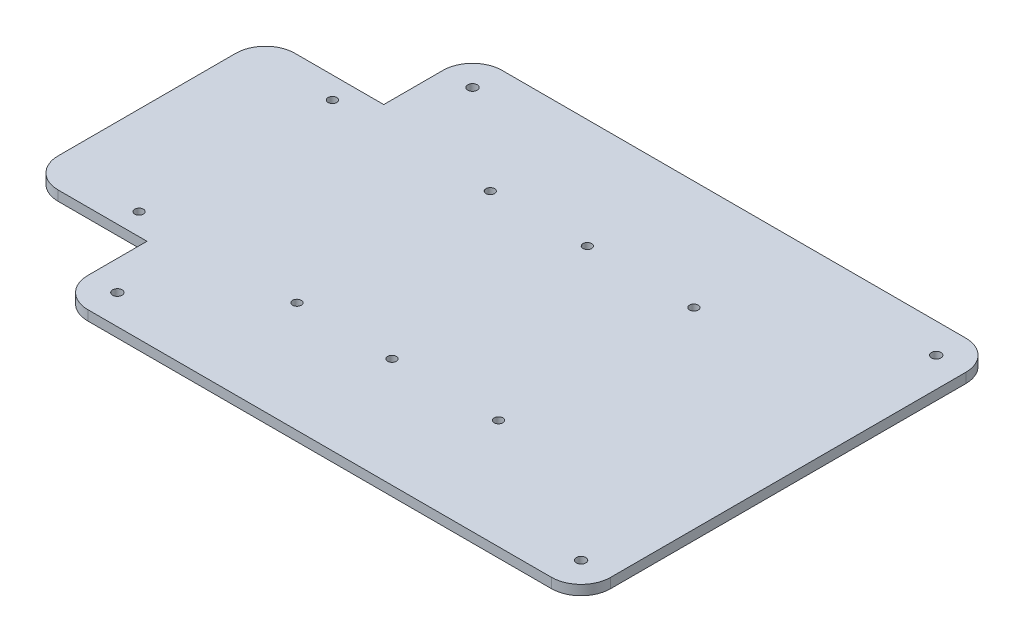
ISO-10303-21;
HEADER;
FILE_DESCRIPTION(('STEP AP214'),'2;1');
FILE_NAME('part.step','',(''),(''),'','','');
FILE_SCHEMA(('AUTOMOTIVE_DESIGN { 1 0 10303 214 1 1 1 1 }'));
ENDSEC;
DATA;
#1=APPLICATION_CONTEXT('core data for automotive mechanical design processes');
#2=APPLICATION_PROTOCOL_DEFINITION('international standard','automotive_design',2000,#1);
#3=PRODUCT_CONTEXT('',#1,'mechanical');
#4=PRODUCT('Part','Part','',(#3));
#5=PRODUCT_RELATED_PRODUCT_CATEGORY('part','',(#4));
#6=PRODUCT_DEFINITION_FORMATION('','',#4);
#7=PRODUCT_DEFINITION_CONTEXT('part definition',#1,'design');
#8=PRODUCT_DEFINITION('design','',#6,#7);
#9=PRODUCT_DEFINITION_SHAPE('','',#8);
#10=(LENGTH_UNIT() NAMED_UNIT(*) SI_UNIT(.MILLI.,.METRE.));
#11=(NAMED_UNIT(*) PLANE_ANGLE_UNIT() SI_UNIT($,.RADIAN.));
#12=(NAMED_UNIT(*) SI_UNIT($,.STERADIAN.) SOLID_ANGLE_UNIT());
#13=UNCERTAINTY_MEASURE_WITH_UNIT(LENGTH_MEASURE(1.E-05),#10,'distance_accuracy_value','');
#14=(GEOMETRIC_REPRESENTATION_CONTEXT(3) GLOBAL_UNCERTAINTY_ASSIGNED_CONTEXT((#13)) GLOBAL_UNIT_ASSIGNED_CONTEXT((#10,
#11,#12)) REPRESENTATION_CONTEXT('',''));
#15=CARTESIAN_POINT('',(0.,0.,0.));
#16=DIRECTION('',(0.,0.,1.));
#17=DIRECTION('',(1.,0.,0.));
#18=AXIS2_PLACEMENT_3D('',#15,#16,#17);
#19=CARTESIAN_POINT('',(-132.5,5.,-105.));
#20=DIRECTION('',(1.,0.,0.));
#21=DIRECTION('',(0.,0.,-1.));
#22=AXIS2_PLACEMENT_3D('',#19,#20,#21);
#23=PLANE('',#22);
#24=DIRECTION('',(0.,-1.,0.));
#25=VECTOR('',#24,1.);
#26=CARTESIAN_POINT('',(-132.5,5.,-60.));
#27=LINE('',#26,#25);
#28=CARTESIAN_POINT('',(-132.5,5.,-60.));
#29=VERTEX_POINT('',#28);
#30=CARTESIAN_POINT('',(-132.5,0.,-60.));
#31=VERTEX_POINT('',#30);
#32=EDGE_CURVE('E169',#29,#31,#27,.T.);
#33=ORIENTED_EDGE('',*,*,#32,.F.);
#34=DIRECTION('',(0.,0.,1.));
#35=VECTOR('',#34,1.);
#36=CARTESIAN_POINT('',(-132.5,5.,-105.));
#37=LINE('',#36,#35);
#38=CARTESIAN_POINT('',(-132.5,5.,-90.));
#39=VERTEX_POINT('',#38);
#40=EDGE_CURVE('E201',#39,#29,#37,.T.);
#41=ORIENTED_EDGE('',*,*,#40,.F.);
#42=DIRECTION('',(0.,-1.,0.));
#43=VECTOR('',#42,1.);
#44=CARTESIAN_POINT('',(-132.5,5.,-90.));
#45=LINE('',#44,#43);
#46=CARTESIAN_POINT('',(-132.5,0.,-90.));
#47=VERTEX_POINT('',#46);
#48=EDGE_CURVE('E234',#39,#47,#45,.T.);
#49=ORIENTED_EDGE('',*,*,#48,.T.);
#50=DIRECTION('',(0.,0.,1.));
#51=VECTOR('',#50,1.);
#52=CARTESIAN_POINT('',(-132.5,0.,-105.));
#53=LINE('',#52,#51);
#54=EDGE_CURVE('E163',#47,#31,#53,.T.);
#55=ORIENTED_EDGE('',*,*,#54,.T.);
#56=EDGE_LOOP('',(#33,#41,#49,#55));
#57=FACE_BOUND('',#56,.T.);
#58=ADVANCED_FACE('F37',(#57),#23,.F.);
#59=DIRECTION('',(0.,-1.,0.));
#60=VECTOR('',#59,1.);
#61=CARTESIAN_POINT('',(-132.5,5.,60.));
#62=LINE('',#61,#60);
#63=CARTESIAN_POINT('',(-132.5,5.,60.));
#64=VERTEX_POINT('',#63);
#65=CARTESIAN_POINT('',(-132.5,0.,60.));
#66=VERTEX_POINT('',#65);
#67=EDGE_CURVE('E148',#64,#66,#62,.T.);
#68=ORIENTED_EDGE('',*,*,#67,.T.);
#69=CARTESIAN_POINT('',(-132.5,0.,90.));
#70=VERTEX_POINT('',#69);
#71=EDGE_CURVE('E156',#66,#70,#53,.T.);
#72=ORIENTED_EDGE('',*,*,#71,.T.);
#73=DIRECTION('',(0.,-1.,0.));
#74=VECTOR('',#73,1.);
#75=CARTESIAN_POINT('',(-132.5,5.,90.));
#76=LINE('',#75,#74);
#77=CARTESIAN_POINT('',(-132.5,5.,90.));
#78=VERTEX_POINT('',#77);
#79=EDGE_CURVE('E237',#70,#78,#76,.F.);
#80=ORIENTED_EDGE('',*,*,#79,.T.);
#81=EDGE_CURVE('E168',#64,#78,#37,.T.);
#82=ORIENTED_EDGE('',*,*,#81,.F.);
#83=EDGE_LOOP('',(#68,#72,#80,#82));
#84=FACE_BOUND('',#83,.T.);
#85=ADVANCED_FACE('F167',(#84),#23,.F.);
#86=CARTESIAN_POINT('',(-132.5,5.,105.));
#87=DIRECTION('',(0.,0.,-1.));
#88=DIRECTION('',(-1.,0.,0.));
#89=AXIS2_PLACEMENT_3D('',#86,#87,#88);
#90=PLANE('',#89);
#91=DIRECTION('',(1.,0.,0.));
#92=VECTOR('',#91,1.);
#93=CARTESIAN_POINT('',(-132.5,5.,105.));
#94=LINE('',#93,#92);
#95=CARTESIAN_POINT('',(-117.5,5.,105.));
#96=VERTEX_POINT('',#95);
#97=CARTESIAN_POINT('',(117.5,5.,105.));
#98=VERTEX_POINT('',#97);
#99=EDGE_CURVE('E204',#96,#98,#94,.T.);
#100=ORIENTED_EDGE('',*,*,#99,.F.);
#101=DIRECTION('',(0.,-1.,0.));
#102=VECTOR('',#101,1.);
#103=CARTESIAN_POINT('',(-117.5,5.,105.));
#104=LINE('',#103,#102);
#105=CARTESIAN_POINT('',(-117.5,0.,105.));
#106=VERTEX_POINT('',#105);
#107=EDGE_CURVE('E224',#96,#106,#104,.T.);
#108=ORIENTED_EDGE('',*,*,#107,.T.);
#109=DIRECTION('',(1.,0.,0.));
#110=VECTOR('',#109,1.);
#111=CARTESIAN_POINT('',(-132.5,0.,105.));
#112=LINE('',#111,#110);
#113=CARTESIAN_POINT('',(117.5,0.,105.));
#114=VERTEX_POINT('',#113);
#115=EDGE_CURVE('E214',#106,#114,#112,.T.);
#116=ORIENTED_EDGE('',*,*,#115,.T.);
#117=DIRECTION('',(0.,-1.,0.));
#118=VECTOR('',#117,1.);
#119=CARTESIAN_POINT('',(117.5,5.,105.));
#120=LINE('',#119,#118);
#121=EDGE_CURVE('E212',#114,#98,#120,.F.);
#122=ORIENTED_EDGE('',*,*,#121,.T.);
#123=EDGE_LOOP('',(#100,#108,#116,#122));
#124=FACE_BOUND('',#123,.T.);
#125=ADVANCED_FACE('F351',(#124),#90,.F.);
#126=CARTESIAN_POINT('',(132.5,5.,-105.));
#127=DIRECTION('',(-1.,0.,0.));
#128=DIRECTION('',(0.,0.,1.));
#129=AXIS2_PLACEMENT_3D('',#126,#127,#128);
#130=PLANE('',#129);
#131=DIRECTION('',(0.,0.,-1.));
#132=VECTOR('',#131,1.);
#133=CARTESIAN_POINT('',(132.5,5.,-105.));
#134=LINE('',#133,#132);
#135=CARTESIAN_POINT('',(132.5,5.,90.));
#136=VERTEX_POINT('',#135);
#137=CARTESIAN_POINT('',(132.5,5.,-90.));
#138=VERTEX_POINT('',#137);
#139=EDGE_CURVE('E207',#136,#138,#134,.T.);
#140=ORIENTED_EDGE('',*,*,#139,.F.);
#141=DIRECTION('',(0.,-1.,0.));
#142=VECTOR('',#141,1.);
#143=CARTESIAN_POINT('',(132.5,5.,90.));
#144=LINE('',#143,#142);
#145=CARTESIAN_POINT('',(132.5,0.,90.));
#146=VERTEX_POINT('',#145);
#147=EDGE_CURVE('E249',#136,#146,#144,.T.);
#148=ORIENTED_EDGE('',*,*,#147,.T.);
#149=DIRECTION('',(0.,0.,-1.));
#150=VECTOR('',#149,1.);
#151=CARTESIAN_POINT('',(132.5,0.,-105.));
#152=LINE('',#151,#150);
#153=CARTESIAN_POINT('',(132.5,0.,-90.));
#154=VERTEX_POINT('',#153);
#155=EDGE_CURVE('E217',#146,#154,#152,.T.);
#156=ORIENTED_EDGE('',*,*,#155,.T.);
#157=DIRECTION('',(0.,-1.,0.));
#158=VECTOR('',#157,1.);
#159=CARTESIAN_POINT('',(132.5,5.,-90.));
#160=LINE('',#159,#158);
#161=EDGE_CURVE('E247',#154,#138,#160,.F.);
#162=ORIENTED_EDGE('',*,*,#161,.T.);
#163=EDGE_LOOP('',(#140,#148,#156,#162));
#164=FACE_BOUND('',#163,.T.);
#165=ADVANCED_FACE('F343',(#164),#130,.F.);
#166=CARTESIAN_POINT('',(-132.5,5.,-105.));
#167=DIRECTION('',(0.,0.,1.));
#168=DIRECTION('',(1.,0.,0.));
#169=AXIS2_PLACEMENT_3D('',#166,#167,#168);
#170=PLANE('',#169);
#171=DIRECTION('',(-1.,0.,0.));
#172=VECTOR('',#171,1.);
#173=CARTESIAN_POINT('',(-132.5,5.,-105.));
#174=LINE('',#173,#172);
#175=CARTESIAN_POINT('',(117.5,5.,-105.));
#176=VERTEX_POINT('',#175);
#177=CARTESIAN_POINT('',(-117.5,5.,-105.));
#178=VERTEX_POINT('',#177);
#179=EDGE_CURVE('E210',#176,#178,#174,.T.);
#180=ORIENTED_EDGE('',*,*,#179,.F.);
#181=DIRECTION('',(0.,-1.,0.));
#182=VECTOR('',#181,1.);
#183=CARTESIAN_POINT('',(117.5,5.,-105.));
#184=LINE('',#183,#182);
#185=CARTESIAN_POINT('',(117.5,0.,-105.));
#186=VERTEX_POINT('',#185);
#187=EDGE_CURVE('E254',#176,#186,#184,.T.);
#188=ORIENTED_EDGE('',*,*,#187,.T.);
#189=DIRECTION('',(-1.,0.,0.));
#190=VECTOR('',#189,1.);
#191=CARTESIAN_POINT('',(-132.5,0.,-105.));
#192=LINE('',#191,#190);
#193=CARTESIAN_POINT('',(-117.5,0.,-105.));
#194=VERTEX_POINT('',#193);
#195=EDGE_CURVE('E220',#186,#194,#192,.T.);
#196=ORIENTED_EDGE('',*,*,#195,.T.);
#197=DIRECTION('',(0.,-1.,0.));
#198=VECTOR('',#197,1.);
#199=CARTESIAN_POINT('',(-117.5,5.,-105.));
#200=LINE('',#199,#198);
#201=EDGE_CURVE('E252',#194,#178,#200,.F.);
#202=ORIENTED_EDGE('',*,*,#201,.T.);
#203=EDGE_LOOP('',(#180,#188,#196,#202));
#204=FACE_BOUND('',#203,.T.);
#205=ADVANCED_FACE('F334',(#204),#170,.F.);
#206=CARTESIAN_POINT('',(0.,5.,0.));
#207=DIRECTION('',(0.,1.,0.));
#208=DIRECTION('',(0.,0.,1.));
#209=AXIS2_PLACEMENT_3D('',#206,#207,#208);
#210=PLANE('',#209);
#211=CARTESIAN_POINT('',(-18.8,5.,49.5));
#212=DIRECTION('',(0.,1.,0.));
#213=DIRECTION('',(0.,0.,-1.));
#214=AXIS2_PLACEMENT_3D('',#211,#212,#213);
#215=CIRCLE('',#214,2.2);
#216=CARTESIAN_POINT('',(-18.8,5.,47.3));
#217=VERTEX_POINT('',#216);
#218=EDGE_CURVE('E480',#217,#217,#215,.T.);
#219=ORIENTED_EDGE('',*,*,#218,.F.);
#220=EDGE_LOOP('',(#219));
#221=FACE_BOUND('',#220,.T.);
#222=CARTESIAN_POINT('',(35.2,5.,49.5));
#223=DIRECTION('',(0.,1.,0.));
#224=DIRECTION('',(0.,0.,-1.));
#225=AXIS2_PLACEMENT_3D('',#222,#223,#224);
#226=CIRCLE('',#225,2.19999999999998);
#227=CARTESIAN_POINT('',(35.2,5.,47.3));
#228=VERTEX_POINT('',#227);
#229=EDGE_CURVE('E475',#228,#228,#226,.T.);
#230=ORIENTED_EDGE('',*,*,#229,.F.);
#231=EDGE_LOOP('',(#230));
#232=FACE_BOUND('',#231,.T.);
#233=CARTESIAN_POINT('',(35.2,5.,-49.5));
#234=DIRECTION('',(0.,1.,0.));
#235=DIRECTION('',(0.,0.,1.));
#236=AXIS2_PLACEMENT_3D('',#233,#234,#235);
#237=CIRCLE('',#236,2.19999999999998);
#238=CARTESIAN_POINT('',(35.2,5.,-47.3));
#239=VERTEX_POINT('',#238);
#240=EDGE_CURVE('E436',#239,#239,#237,.T.);
#241=ORIENTED_EDGE('',*,*,#240,.F.);
#242=EDGE_LOOP('',(#241));
#243=FACE_BOUND('',#242,.T.);
#244=CARTESIAN_POINT('',(-18.8,5.,-49.5));
#245=DIRECTION('',(0.,1.,0.));
#246=DIRECTION('',(0.,0.,1.));
#247=AXIS2_PLACEMENT_3D('',#244,#245,#246);
#248=CIRCLE('',#247,2.2);
#249=CARTESIAN_POINT('',(-18.8,5.,-47.3));
#250=VERTEX_POINT('',#249);
#251=EDGE_CURVE('E287',#250,#250,#248,.T.);
#252=ORIENTED_EDGE('',*,*,#251,.F.);
#253=EDGE_LOOP('',(#252));
#254=FACE_BOUND('',#253,.T.);
#255=CARTESIAN_POINT('',(-147.5,5.,49.));
#256=DIRECTION('',(0.,1.,0.));
#257=DIRECTION('',(0.,0.,-1.));
#258=AXIS2_PLACEMENT_3D('',#255,#256,#257);
#259=CIRCLE('',#258,2.20000000000001);
#260=CARTESIAN_POINT('',(-147.5,5.,46.8));
#261=VERTEX_POINT('',#260);
#262=EDGE_CURVE('E294',#261,#261,#259,.T.);
#263=ORIENTED_EDGE('',*,*,#262,.F.);
#264=EDGE_LOOP('',(#263));
#265=FACE_BOUND('',#264,.T.);
#266=CARTESIAN_POINT('',(-67.5,5.,49.));
#267=DIRECTION('',(0.,1.,0.));
#268=DIRECTION('',(0.,0.,-1.));
#269=AXIS2_PLACEMENT_3D('',#266,#267,#268);
#270=CIRCLE('',#269,2.2);
#271=CARTESIAN_POINT('',(-67.5,5.,46.8));
#272=VERTEX_POINT('',#271);
#273=EDGE_CURVE('E298',#272,#272,#270,.T.);
#274=ORIENTED_EDGE('',*,*,#273,.F.);
#275=EDGE_LOOP('',(#274));
#276=FACE_BOUND('',#275,.T.);
#277=CARTESIAN_POINT('',(-67.5,5.,-49.));
#278=DIRECTION('',(0.,1.,0.));
#279=DIRECTION('',(0.,0.,1.));
#280=AXIS2_PLACEMENT_3D('',#277,#278,#279);
#281=CIRCLE('',#280,2.2);
#282=CARTESIAN_POINT('',(-67.5,5.,-46.8));
#283=VERTEX_POINT('',#282);
#284=EDGE_CURVE('E303',#283,#283,#281,.T.);
#285=ORIENTED_EDGE('',*,*,#284,.F.);
#286=EDGE_LOOP('',(#285));
#287=FACE_BOUND('',#286,.T.);
#288=CARTESIAN_POINT('',(-147.5,5.,-49.));
#289=DIRECTION('',(0.,1.,0.));
#290=DIRECTION('',(0.,0.,1.));
#291=AXIS2_PLACEMENT_3D('',#288,#289,#290);
#292=CIRCLE('',#291,2.20000000000001);
#293=CARTESIAN_POINT('',(-147.5,5.,-46.8));
#294=VERTEX_POINT('',#293);
#295=EDGE_CURVE('E273',#294,#294,#292,.T.);
#296=ORIENTED_EDGE('',*,*,#295,.F.);
#297=EDGE_LOOP('',(#296));
#298=FACE_BOUND('',#297,.T.);
#299=CARTESIAN_POINT('',(-117.5,5.,90.));
#300=DIRECTION('',(0.,1.,0.));
#301=DIRECTION('',(0.,0.,-1.));
#302=AXIS2_PLACEMENT_3D('',#299,#300,#301);
#303=CIRCLE('',#302,2.4);
#304=CARTESIAN_POINT('',(-117.5,5.,87.6));
#305=VERTEX_POINT('',#304);
#306=EDGE_CURVE('E192',#305,#305,#303,.T.);
#307=ORIENTED_EDGE('',*,*,#306,.F.);
#308=EDGE_LOOP('',(#307));
#309=FACE_BOUND('',#308,.T.);
#310=CARTESIAN_POINT('',(117.5,5.,90.));
#311=DIRECTION('',(0.,1.,0.));
#312=DIRECTION('',(0.,0.,1.));
#313=AXIS2_PLACEMENT_3D('',#310,#311,#312);
#314=CIRCLE('',#313,2.4);
#315=CARTESIAN_POINT('',(117.5,5.,92.4));
#316=VERTEX_POINT('',#315);
#317=EDGE_CURVE('E186',#316,#316,#314,.T.);
#318=ORIENTED_EDGE('',*,*,#317,.F.);
#319=EDGE_LOOP('',(#318));
#320=FACE_BOUND('',#319,.T.);
#321=CARTESIAN_POINT('',(117.5,5.,-90.));
#322=DIRECTION('',(0.,1.,0.));
#323=DIRECTION('',(0.,0.,-1.));
#324=AXIS2_PLACEMENT_3D('',#321,#322,#323);
#325=CIRCLE('',#324,2.4);
#326=CARTESIAN_POINT('',(117.5,5.,-92.4));
#327=VERTEX_POINT('',#326);
#328=EDGE_CURVE('E179',#327,#327,#325,.T.);
#329=ORIENTED_EDGE('',*,*,#328,.F.);
#330=EDGE_LOOP('',(#329));
#331=FACE_BOUND('',#330,.T.);
#332=CARTESIAN_POINT('',(-117.5,5.,-90.));
#333=DIRECTION('',(0.,1.,0.));
#334=DIRECTION('',(0.,0.,1.));
#335=AXIS2_PLACEMENT_3D('',#332,#333,#334);
#336=CIRCLE('',#335,2.4);
#337=CARTESIAN_POINT('',(-117.5,5.,-87.6));
#338=VERTEX_POINT('',#337);
#339=EDGE_CURVE('E182',#338,#338,#336,.T.);
#340=ORIENTED_EDGE('',*,*,#339,.F.);
#341=EDGE_LOOP('',(#340));
#342=FACE_BOUND('',#341,.T.);
#343=DIRECTION('',(0.,0.,1.));
#344=VECTOR('',#343,1.);
#345=CARTESIAN_POINT('',(-192.5,5.,-60.));
#346=LINE('',#345,#344);
#347=CARTESIAN_POINT('',(-192.5,5.,-45.));
#348=VERTEX_POINT('',#347);
#349=CARTESIAN_POINT('',(-192.5,5.,45.));
#350=VERTEX_POINT('',#349);
#351=EDGE_CURVE('E175',#348,#350,#346,.T.);
#352=ORIENTED_EDGE('',*,*,#351,.T.);
#353=CARTESIAN_POINT('',(-177.5,5.,45.));
#354=DIRECTION('',(0.,1.,0.));
#355=DIRECTION('',(0.,0.,1.));
#356=AXIS2_PLACEMENT_3D('',#353,#354,#355);
#357=CIRCLE('',#356,15.);
#358=CARTESIAN_POINT('',(-177.5,5.,60.));
#359=VERTEX_POINT('',#358);
#360=EDGE_CURVE('E46',#350,#359,#357,.T.);
#361=ORIENTED_EDGE('',*,*,#360,.T.);
#362=DIRECTION('',(1.,0.,0.));
#363=VECTOR('',#362,1.);
#364=CARTESIAN_POINT('',(-132.5,5.,60.));
#365=LINE('',#364,#363);
#366=EDGE_CURVE('E170',#359,#64,#365,.T.);
#367=ORIENTED_EDGE('',*,*,#366,.T.);
#368=ORIENTED_EDGE('',*,*,#81,.T.);
#369=CARTESIAN_POINT('',(-117.5,5.,90.));
#370=DIRECTION('',(0.,1.,0.));
#371=DIRECTION('',(0.,0.,1.));
#372=AXIS2_PLACEMENT_3D('',#369,#370,#371);
#373=CIRCLE('',#372,15.);
#374=EDGE_CURVE('E245',#78,#96,#373,.T.);
#375=ORIENTED_EDGE('',*,*,#374,.T.);
#376=ORIENTED_EDGE('',*,*,#99,.T.);
#377=CARTESIAN_POINT('',(117.5,5.,90.));
#378=DIRECTION('',(0.,1.,0.));
#379=DIRECTION('',(0.,0.,1.));
#380=AXIS2_PLACEMENT_3D('',#377,#378,#379);
#381=CIRCLE('',#380,15.);
#382=EDGE_CURVE('E243',#98,#136,#381,.T.);
#383=ORIENTED_EDGE('',*,*,#382,.T.);
#384=ORIENTED_EDGE('',*,*,#139,.T.);
#385=CARTESIAN_POINT('',(117.5,5.,-90.));
#386=DIRECTION('',(0.,1.,0.));
#387=DIRECTION('',(0.,0.,1.));
#388=AXIS2_PLACEMENT_3D('',#385,#386,#387);
#389=CIRCLE('',#388,15.);
#390=EDGE_CURVE('E241',#138,#176,#389,.T.);
#391=ORIENTED_EDGE('',*,*,#390,.T.);
#392=ORIENTED_EDGE('',*,*,#179,.T.);
#393=CARTESIAN_POINT('',(-117.5,5.,-90.));
#394=DIRECTION('',(0.,1.,0.));
#395=DIRECTION('',(0.,0.,1.));
#396=AXIS2_PLACEMENT_3D('',#393,#394,#395);
#397=CIRCLE('',#396,15.);
#398=EDGE_CURVE('E239',#178,#39,#397,.T.);
#399=ORIENTED_EDGE('',*,*,#398,.T.);
#400=ORIENTED_EDGE('',*,*,#40,.T.);
#401=DIRECTION('',(-1.,0.,0.));
#402=VECTOR('',#401,1.);
#403=CARTESIAN_POINT('',(-132.5,5.,-60.));
#404=LINE('',#403,#402);
#405=CARTESIAN_POINT('',(-177.5,5.,-60.));
#406=VERTEX_POINT('',#405);
#407=EDGE_CURVE('E152',#29,#406,#404,.T.);
#408=ORIENTED_EDGE('',*,*,#407,.T.);
#409=CARTESIAN_POINT('',(-177.5,5.,-45.));
#410=DIRECTION('',(0.,1.,0.));
#411=DIRECTION('',(0.,0.,1.));
#412=AXIS2_PLACEMENT_3D('',#409,#410,#411);
#413=CIRCLE('',#412,15.);
#414=EDGE_CURVE('E266',#406,#348,#413,.T.);
#415=ORIENTED_EDGE('',*,*,#414,.T.);
#416=EDGE_LOOP('',(#352,#361,#367,#368,#375,#376,#383,#384,#391,#392,#399,#400,#408,#415));
#417=FACE_BOUND('',#416,.T.);
#418=ADVANCED_FACE('F318',(#221,#232,#243,#254,#265,#276,#287,#298,#309,#320,#331,#342,#417),
#210,.T.);
#419=CARTESIAN_POINT('',(0.,0.,0.));
#420=DIRECTION('',(0.,1.,0.));
#421=DIRECTION('',(0.,0.,1.));
#422=AXIS2_PLACEMENT_3D('',#419,#420,#421);
#423=PLANE('',#422);
#424=CARTESIAN_POINT('',(-18.8,0.,49.5));
#425=DIRECTION('',(0.,1.,0.));
#426=DIRECTION('',(0.,0.,1.));
#427=AXIS2_PLACEMENT_3D('',#424,#425,#426);
#428=CIRCLE('',#427,2.2);
#429=CARTESIAN_POINT('',(-18.8,0.,51.7));
#430=VERTEX_POINT('',#429);
#431=EDGE_CURVE('E41',#430,#430,#428,.T.);
#432=ORIENTED_EDGE('',*,*,#431,.T.);
#433=EDGE_LOOP('',(#432));
#434=FACE_BOUND('',#433,.T.);
#435=CARTESIAN_POINT('',(35.2,0.,49.5));
#436=DIRECTION('',(0.,1.,0.));
#437=DIRECTION('',(0.,0.,1.));
#438=AXIS2_PLACEMENT_3D('',#435,#436,#437);
#439=CIRCLE('',#438,2.19999999999998);
#440=CARTESIAN_POINT('',(35.2,0.,51.7));
#441=VERTEX_POINT('',#440);
#442=EDGE_CURVE('E289',#441,#441,#439,.T.);
#443=ORIENTED_EDGE('',*,*,#442,.T.);
#444=EDGE_LOOP('',(#443));
#445=FACE_BOUND('',#444,.T.);
#446=CARTESIAN_POINT('',(35.2,0.,-49.5));
#447=DIRECTION('',(0.,1.,0.));
#448=DIRECTION('',(0.,0.,1.));
#449=AXIS2_PLACEMENT_3D('',#446,#447,#448);
#450=CIRCLE('',#449,2.19999999999998);
#451=CARTESIAN_POINT('',(35.2,0.,-47.3));
#452=VERTEX_POINT('',#451);
#453=EDGE_CURVE('E286',#452,#452,#450,.T.);
#454=ORIENTED_EDGE('',*,*,#453,.T.);
#455=EDGE_LOOP('',(#454));
#456=FACE_BOUND('',#455,.T.);
#457=CARTESIAN_POINT('',(-18.8,0.,-49.5));
#458=DIRECTION('',(0.,1.,0.));
#459=DIRECTION('',(0.,0.,1.));
#460=AXIS2_PLACEMENT_3D('',#457,#458,#459);
#461=CIRCLE('',#460,2.2);
#462=CARTESIAN_POINT('',(-18.8,0.,-47.3));
#463=VERTEX_POINT('',#462);
#464=EDGE_CURVE('E283',#463,#463,#461,.T.);
#465=ORIENTED_EDGE('',*,*,#464,.T.);
#466=EDGE_LOOP('',(#465));
#467=FACE_BOUND('',#466,.T.);
#468=CARTESIAN_POINT('',(-147.5,0.,49.));
#469=DIRECTION('',(0.,1.,0.));
#470=DIRECTION('',(0.,0.,1.));
#471=AXIS2_PLACEMENT_3D('',#468,#469,#470);
#472=CIRCLE('',#471,2.20000000000001);
#473=CARTESIAN_POINT('',(-147.5,0.,51.2));
#474=VERTEX_POINT('',#473);
#475=EDGE_CURVE('E279',#474,#474,#472,.T.);
#476=ORIENTED_EDGE('',*,*,#475,.T.);
#477=EDGE_LOOP('',(#476));
#478=FACE_BOUND('',#477,.T.);
#479=CARTESIAN_POINT('',(-67.5,0.,49.));
#480=DIRECTION('',(0.,1.,0.));
#481=DIRECTION('',(0.,0.,1.));
#482=AXIS2_PLACEMENT_3D('',#479,#480,#481);
#483=CIRCLE('',#482,2.2);
#484=CARTESIAN_POINT('',(-67.5,0.,51.2));
#485=VERTEX_POINT('',#484);
#486=EDGE_CURVE('E276',#485,#485,#483,.T.);
#487=ORIENTED_EDGE('',*,*,#486,.T.);
#488=EDGE_LOOP('',(#487));
#489=FACE_BOUND('',#488,.T.);
#490=CARTESIAN_POINT('',(-67.5,0.,-49.));
#491=DIRECTION('',(0.,1.,0.));
#492=DIRECTION('',(0.,0.,1.));
#493=AXIS2_PLACEMENT_3D('',#490,#491,#492);
#494=CIRCLE('',#493,2.2);
#495=CARTESIAN_POINT('',(-67.5,0.,-46.8));
#496=VERTEX_POINT('',#495);
#497=EDGE_CURVE('E272',#496,#496,#494,.T.);
#498=ORIENTED_EDGE('',*,*,#497,.T.);
#499=EDGE_LOOP('',(#498));
#500=FACE_BOUND('',#499,.T.);
#501=CARTESIAN_POINT('',(-147.5,0.,-49.));
#502=DIRECTION('',(0.,1.,0.));
#503=DIRECTION('',(0.,0.,1.));
#504=AXIS2_PLACEMENT_3D('',#501,#502,#503);
#505=CIRCLE('',#504,2.20000000000001);
#506=CARTESIAN_POINT('',(-147.5,0.,-46.8));
#507=VERTEX_POINT('',#506);
#508=EDGE_CURVE('E269',#507,#507,#505,.T.);
#509=ORIENTED_EDGE('',*,*,#508,.T.);
#510=EDGE_LOOP('',(#509));
#511=FACE_BOUND('',#510,.T.);
#512=CARTESIAN_POINT('',(-117.5,0.,90.));
#513=DIRECTION('',(0.,1.,0.));
#514=DIRECTION('',(0.,0.,-1.));
#515=AXIS2_PLACEMENT_3D('',#512,#513,#514);
#516=CIRCLE('',#515,2.4);
#517=CARTESIAN_POINT('',(-117.5,0.,87.6));
#518=VERTEX_POINT('',#517);
#519=EDGE_CURVE('E173',#518,#518,#516,.T.);
#520=ORIENTED_EDGE('',*,*,#519,.T.);
#521=EDGE_LOOP('',(#520));
#522=FACE_BOUND('',#521,.T.);
#523=CARTESIAN_POINT('',(117.5,0.,90.));
#524=DIRECTION('',(0.,1.,0.));
#525=DIRECTION('',(0.,0.,1.));
#526=AXIS2_PLACEMENT_3D('',#523,#524,#525);
#527=CIRCLE('',#526,2.4);
#528=CARTESIAN_POINT('',(117.5,0.,92.4));
#529=VERTEX_POINT('',#528);
#530=EDGE_CURVE('E189',#529,#529,#527,.T.);
#531=ORIENTED_EDGE('',*,*,#530,.T.);
#532=EDGE_LOOP('',(#531));
#533=FACE_BOUND('',#532,.T.);
#534=CARTESIAN_POINT('',(117.5,0.,-90.));
#535=DIRECTION('',(0.,1.,0.));
#536=DIRECTION('',(0.,0.,-1.));
#537=AXIS2_PLACEMENT_3D('',#534,#535,#536);
#538=CIRCLE('',#537,2.4);
#539=CARTESIAN_POINT('',(117.5,0.,-92.4));
#540=VERTEX_POINT('',#539);
#541=EDGE_CURVE('E183',#540,#540,#538,.T.);
#542=ORIENTED_EDGE('',*,*,#541,.T.);
#543=EDGE_LOOP('',(#542));
#544=FACE_BOUND('',#543,.T.);
#545=CARTESIAN_POINT('',(-117.5,0.,-90.));
#546=DIRECTION('',(0.,1.,0.));
#547=DIRECTION('',(0.,0.,1.));
#548=AXIS2_PLACEMENT_3D('',#545,#546,#547);
#549=CIRCLE('',#548,2.4);
#550=CARTESIAN_POINT('',(-117.5,0.,-87.6));
#551=VERTEX_POINT('',#550);
#552=EDGE_CURVE('E164',#551,#551,#549,.T.);
#553=ORIENTED_EDGE('',*,*,#552,.T.);
#554=EDGE_LOOP('',(#553));
#555=FACE_BOUND('',#554,.T.);
#556=DIRECTION('',(1.,0.,0.));
#557=VECTOR('',#556,1.);
#558=CARTESIAN_POINT('',(-132.5,0.,60.));
#559=LINE('',#558,#557);
#560=CARTESIAN_POINT('',(-177.5,0.,60.));
#561=VERTEX_POINT('',#560);
#562=EDGE_CURVE('E143',#561,#66,#559,.T.);
#563=ORIENTED_EDGE('',*,*,#562,.F.);
#564=CARTESIAN_POINT('',(-177.5,0.,45.));
#565=DIRECTION('',(0.,1.,0.));
#566=DIRECTION('',(0.,0.,1.));
#567=AXIS2_PLACEMENT_3D('',#564,#565,#566);
#568=CIRCLE('',#567,15.);
#569=CARTESIAN_POINT('',(-192.5,0.,45.));
#570=VERTEX_POINT('',#569);
#571=EDGE_CURVE('E260',#561,#570,#568,.F.);
#572=ORIENTED_EDGE('',*,*,#571,.T.);
#573=DIRECTION('',(0.,0.,1.));
#574=VECTOR('',#573,1.);
#575=CARTESIAN_POINT('',(-192.5,0.,-60.));
#576=LINE('',#575,#574);
#577=CARTESIAN_POINT('',(-192.5,0.,-45.));
#578=VERTEX_POINT('',#577);
#579=EDGE_CURVE('E153',#578,#570,#576,.T.);
#580=ORIENTED_EDGE('',*,*,#579,.F.);
#581=CARTESIAN_POINT('',(-177.5,0.,-45.));
#582=DIRECTION('',(0.,1.,0.));
#583=DIRECTION('',(0.,0.,1.));
#584=AXIS2_PLACEMENT_3D('',#581,#582,#583);
#585=CIRCLE('',#584,15.);
#586=CARTESIAN_POINT('',(-177.5,0.,-60.));
#587=VERTEX_POINT('',#586);
#588=EDGE_CURVE('E258',#578,#587,#585,.F.);
#589=ORIENTED_EDGE('',*,*,#588,.T.);
#590=DIRECTION('',(-1.,0.,0.));
#591=VECTOR('',#590,1.);
#592=CARTESIAN_POINT('',(-132.5,0.,-60.));
#593=LINE('',#592,#591);
#594=EDGE_CURVE('E282',#31,#587,#593,.T.);
#595=ORIENTED_EDGE('',*,*,#594,.F.);
#596=ORIENTED_EDGE('',*,*,#54,.F.);
#597=CARTESIAN_POINT('',(-117.5,0.,-90.));
#598=DIRECTION('',(0.,1.,0.));
#599=DIRECTION('',(0.,0.,1.));
#600=AXIS2_PLACEMENT_3D('',#597,#598,#599);
#601=CIRCLE('',#600,15.);
#602=EDGE_CURVE('E227',#47,#194,#601,.F.);
#603=ORIENTED_EDGE('',*,*,#602,.T.);
#604=ORIENTED_EDGE('',*,*,#195,.F.);
#605=CARTESIAN_POINT('',(117.5,0.,-90.));
#606=DIRECTION('',(0.,1.,0.));
#607=DIRECTION('',(0.,0.,1.));
#608=AXIS2_PLACEMENT_3D('',#605,#606,#607);
#609=CIRCLE('',#608,15.);
#610=EDGE_CURVE('E229',#186,#154,#609,.F.);
#611=ORIENTED_EDGE('',*,*,#610,.T.);
#612=ORIENTED_EDGE('',*,*,#155,.F.);
#613=CARTESIAN_POINT('',(117.5,0.,90.));
#614=DIRECTION('',(0.,1.,0.));
#615=DIRECTION('',(0.,0.,1.));
#616=AXIS2_PLACEMENT_3D('',#613,#614,#615);
#617=CIRCLE('',#616,15.);
#618=EDGE_CURVE('E231',#146,#114,#617,.F.);
#619=ORIENTED_EDGE('',*,*,#618,.T.);
#620=ORIENTED_EDGE('',*,*,#115,.F.);
#621=CARTESIAN_POINT('',(-117.5,0.,90.));
#622=DIRECTION('',(0.,1.,0.));
#623=DIRECTION('',(0.,0.,1.));
#624=AXIS2_PLACEMENT_3D('',#621,#622,#623);
#625=CIRCLE('',#624,15.);
#626=EDGE_CURVE('E159',#106,#70,#625,.F.);
#627=ORIENTED_EDGE('',*,*,#626,.T.);
#628=ORIENTED_EDGE('',*,*,#71,.F.);
#629=EDGE_LOOP('',(#563,#572,#580,#589,#595,#596,#603,#604,#611,#612,#619,#620,#627,#628));
#630=FACE_BOUND('',#629,.T.);
#631=ADVANCED_FACE('F157',(#434,#445,#456,#467,#478,#489,#500,#511,#522,#533,#544,#555,#630),
#423,.F.);
#632=CARTESIAN_POINT('',(-117.5,0.,-90.));
#633=DIRECTION('',(0.,1.,0.));
#634=DIRECTION('',(0.,0.,1.));
#635=AXIS2_PLACEMENT_3D('',#632,#633,#634);
#636=CYLINDRICAL_SURFACE('',#635,2.4);
#637=ORIENTED_EDGE('',*,*,#552,.F.);
#638=EDGE_LOOP('',(#637));
#639=FACE_BOUND('',#638,.T.);
#640=ORIENTED_EDGE('',*,*,#339,.T.);
#641=EDGE_LOOP('',(#640));
#642=FACE_BOUND('',#641,.T.);
#643=ADVANCED_FACE('F381',(#639,#642),#636,.F.);
#644=CARTESIAN_POINT('',(117.5,0.,-90.));
#645=DIRECTION('',(0.,1.,0.));
#646=DIRECTION('',(0.,0.,1.));
#647=AXIS2_PLACEMENT_3D('',#644,#645,#646);
#648=CYLINDRICAL_SURFACE('',#647,2.4);
#649=ORIENTED_EDGE('',*,*,#541,.F.);
#650=EDGE_LOOP('',(#649));
#651=FACE_BOUND('',#650,.T.);
#652=ORIENTED_EDGE('',*,*,#328,.T.);
#653=EDGE_LOOP('',(#652));
#654=FACE_BOUND('',#653,.T.);
#655=ADVANCED_FACE('F386',(#651,#654),#648,.F.);
#656=CARTESIAN_POINT('',(117.5,0.,90.));
#657=DIRECTION('',(0.,1.,0.));
#658=DIRECTION('',(0.,0.,1.));
#659=AXIS2_PLACEMENT_3D('',#656,#657,#658);
#660=CYLINDRICAL_SURFACE('',#659,2.4);
#661=ORIENTED_EDGE('',*,*,#530,.F.);
#662=EDGE_LOOP('',(#661));
#663=FACE_BOUND('',#662,.T.);
#664=ORIENTED_EDGE('',*,*,#317,.T.);
#665=EDGE_LOOP('',(#664));
#666=FACE_BOUND('',#665,.T.);
#667=ADVANCED_FACE('F364',(#663,#666),#660,.F.);
#668=CARTESIAN_POINT('',(-117.5,0.,90.));
#669=DIRECTION('',(0.,1.,0.));
#670=DIRECTION('',(0.,0.,1.));
#671=AXIS2_PLACEMENT_3D('',#668,#669,#670);
#672=CYLINDRICAL_SURFACE('',#671,2.4);
#673=ORIENTED_EDGE('',*,*,#519,.F.);
#674=EDGE_LOOP('',(#673));
#675=FACE_BOUND('',#674,.T.);
#676=ORIENTED_EDGE('',*,*,#306,.T.);
#677=EDGE_LOOP('',(#676));
#678=FACE_BOUND('',#677,.T.);
#679=ADVANCED_FACE('F357',(#675,#678),#672,.F.);
#680=CARTESIAN_POINT('',(-117.5,5.,90.));
#681=DIRECTION('',(0.,-1.,0.));
#682=DIRECTION('',(0.,0.,-1.));
#683=AXIS2_PLACEMENT_3D('',#680,#681,#682);
#684=CYLINDRICAL_SURFACE('',#683,15.);
#685=ORIENTED_EDGE('',*,*,#374,.F.);
#686=ORIENTED_EDGE('',*,*,#79,.F.);
#687=ORIENTED_EDGE('',*,*,#626,.F.);
#688=ORIENTED_EDGE('',*,*,#107,.F.);
#689=EDGE_LOOP('',(#685,#686,#687,#688));
#690=FACE_BOUND('',#689,.T.);
#691=ADVANCED_FACE('F355',(#690),#684,.T.);
#692=CARTESIAN_POINT('',(117.5,5.,90.));
#693=DIRECTION('',(0.,-1.,0.));
#694=DIRECTION('',(0.,0.,-1.));
#695=AXIS2_PLACEMENT_3D('',#692,#693,#694);
#696=CYLINDRICAL_SURFACE('',#695,15.);
#697=ORIENTED_EDGE('',*,*,#382,.F.);
#698=ORIENTED_EDGE('',*,*,#121,.F.);
#699=ORIENTED_EDGE('',*,*,#618,.F.);
#700=ORIENTED_EDGE('',*,*,#147,.F.);
#701=EDGE_LOOP('',(#697,#698,#699,#700));
#702=FACE_BOUND('',#701,.T.);
#703=ADVANCED_FACE('F347',(#702),#696,.T.);
#704=CARTESIAN_POINT('',(117.5,5.,-90.));
#705=DIRECTION('',(0.,-1.,0.));
#706=DIRECTION('',(0.,0.,-1.));
#707=AXIS2_PLACEMENT_3D('',#704,#705,#706);
#708=CYLINDRICAL_SURFACE('',#707,15.);
#709=ORIENTED_EDGE('',*,*,#390,.F.);
#710=ORIENTED_EDGE('',*,*,#161,.F.);
#711=ORIENTED_EDGE('',*,*,#610,.F.);
#712=ORIENTED_EDGE('',*,*,#187,.F.);
#713=EDGE_LOOP('',(#709,#710,#711,#712));
#714=FACE_BOUND('',#713,.T.);
#715=ADVANCED_FACE('F338',(#714),#708,.T.);
#716=CARTESIAN_POINT('',(-117.5,5.,-90.));
#717=DIRECTION('',(0.,-1.,0.));
#718=DIRECTION('',(0.,0.,-1.));
#719=AXIS2_PLACEMENT_3D('',#716,#717,#718);
#720=CYLINDRICAL_SURFACE('',#719,15.);
#721=ORIENTED_EDGE('',*,*,#398,.F.);
#722=ORIENTED_EDGE('',*,*,#201,.F.);
#723=ORIENTED_EDGE('',*,*,#602,.F.);
#724=ORIENTED_EDGE('',*,*,#48,.F.);
#725=EDGE_LOOP('',(#721,#722,#723,#724));
#726=FACE_BOUND('',#725,.T.);
#727=ADVANCED_FACE('F331',(#726),#720,.T.);
#728=CARTESIAN_POINT('',(-132.5,5.,-60.));
#729=DIRECTION('',(0.,0.,1.));
#730=DIRECTION('',(1.,0.,0.));
#731=AXIS2_PLACEMENT_3D('',#728,#729,#730);
#732=PLANE('',#731);
#733=ORIENTED_EDGE('',*,*,#594,.T.);
#734=DIRECTION('',(0.,-1.,0.));
#735=VECTOR('',#734,1.);
#736=CARTESIAN_POINT('',(-177.5,5.,-60.));
#737=LINE('',#736,#735);
#738=EDGE_CURVE('E11',#587,#406,#737,.F.);
#739=ORIENTED_EDGE('',*,*,#738,.T.);
#740=ORIENTED_EDGE('',*,*,#407,.F.);
#741=ORIENTED_EDGE('',*,*,#32,.T.);
#742=EDGE_LOOP('',(#733,#739,#740,#741));
#743=FACE_BOUND('',#742,.T.);
#744=ADVANCED_FACE('F323',(#743),#732,.F.);
#745=CARTESIAN_POINT('',(-192.5,5.,-60.));
#746=DIRECTION('',(1.,0.,0.));
#747=DIRECTION('',(0.,0.,-1.));
#748=AXIS2_PLACEMENT_3D('',#745,#746,#747);
#749=PLANE('',#748);
#750=ORIENTED_EDGE('',*,*,#579,.T.);
#751=DIRECTION('',(0.,-1.,0.));
#752=VECTOR('',#751,1.);
#753=CARTESIAN_POINT('',(-192.5,5.,45.));
#754=LINE('',#753,#752);
#755=EDGE_CURVE('E60',#570,#350,#754,.F.);
#756=ORIENTED_EDGE('',*,*,#755,.T.);
#757=ORIENTED_EDGE('',*,*,#351,.F.);
#758=DIRECTION('',(0.,-1.,0.));
#759=VECTOR('',#758,1.);
#760=CARTESIAN_POINT('',(-192.5,5.,-45.));
#761=LINE('',#760,#759);
#762=EDGE_CURVE('E262',#348,#578,#761,.T.);
#763=ORIENTED_EDGE('',*,*,#762,.T.);
#764=EDGE_LOOP('',(#750,#756,#757,#763));
#765=FACE_BOUND('',#764,.T.);
#766=ADVANCED_FACE('F312',(#765),#749,.F.);
#767=CARTESIAN_POINT('',(-132.5,5.,60.));
#768=DIRECTION('',(0.,0.,-1.));
#769=DIRECTION('',(-1.,0.,0.));
#770=AXIS2_PLACEMENT_3D('',#767,#768,#769);
#771=PLANE('',#770);
#772=ORIENTED_EDGE('',*,*,#366,.F.);
#773=DIRECTION('',(0.,-1.,0.));
#774=VECTOR('',#773,1.);
#775=CARTESIAN_POINT('',(-177.5,5.,60.));
#776=LINE('',#775,#774);
#777=EDGE_CURVE('E150',#359,#561,#776,.T.);
#778=ORIENTED_EDGE('',*,*,#777,.T.);
#779=ORIENTED_EDGE('',*,*,#562,.T.);
#780=ORIENTED_EDGE('',*,*,#67,.F.);
#781=EDGE_LOOP('',(#772,#778,#779,#780));
#782=FACE_BOUND('',#781,.T.);
#783=ADVANCED_FACE('F146',(#782),#771,.F.);
#784=CARTESIAN_POINT('',(-177.5,5.,45.));
#785=DIRECTION('',(0.,-1.,0.));
#786=DIRECTION('',(0.,0.,-1.));
#787=AXIS2_PLACEMENT_3D('',#784,#785,#786);
#788=CYLINDRICAL_SURFACE('',#787,15.);
#789=ORIENTED_EDGE('',*,*,#360,.F.);
#790=ORIENTED_EDGE('',*,*,#755,.F.);
#791=ORIENTED_EDGE('',*,*,#571,.F.);
#792=ORIENTED_EDGE('',*,*,#777,.F.);
#793=EDGE_LOOP('',(#789,#790,#791,#792));
#794=FACE_BOUND('',#793,.T.);
#795=ADVANCED_FACE('F316',(#794),#788,.T.);
#796=CARTESIAN_POINT('',(-177.5,5.,-45.));
#797=DIRECTION('',(0.,-1.,0.));
#798=DIRECTION('',(0.,0.,-1.));
#799=AXIS2_PLACEMENT_3D('',#796,#797,#798);
#800=CYLINDRICAL_SURFACE('',#799,15.);
#801=ORIENTED_EDGE('',*,*,#414,.F.);
#802=ORIENTED_EDGE('',*,*,#738,.F.);
#803=ORIENTED_EDGE('',*,*,#588,.F.);
#804=ORIENTED_EDGE('',*,*,#762,.F.);
#805=EDGE_LOOP('',(#801,#802,#803,#804));
#806=FACE_BOUND('',#805,.T.);
#807=ADVANCED_FACE('F39',(#806),#800,.T.);
#808=CARTESIAN_POINT('',(-147.5,-19.,-49.));
#809=DIRECTION('',(0.,1.,0.));
#810=DIRECTION('',(0.,0.,1.));
#811=AXIS2_PLACEMENT_3D('',#808,#809,#810);
#812=CYLINDRICAL_SURFACE('',#811,2.20000000000001);
#813=ORIENTED_EDGE('',*,*,#295,.T.);
#814=EDGE_LOOP('',(#813));
#815=FACE_BOUND('',#814,.T.);
#816=ORIENTED_EDGE('',*,*,#508,.F.);
#817=EDGE_LOOP('',(#816));
#818=FACE_BOUND('',#817,.T.);
#819=ADVANCED_FACE('F401',(#815,#818),#812,.F.);
#820=CARTESIAN_POINT('',(-67.5,-19.,-49.));
#821=DIRECTION('',(0.,1.,0.));
#822=DIRECTION('',(0.,0.,1.));
#823=AXIS2_PLACEMENT_3D('',#820,#821,#822);
#824=CYLINDRICAL_SURFACE('',#823,2.2);
#825=ORIENTED_EDGE('',*,*,#284,.T.);
#826=EDGE_LOOP('',(#825));
#827=FACE_BOUND('',#826,.T.);
#828=ORIENTED_EDGE('',*,*,#497,.F.);
#829=EDGE_LOOP('',(#828));
#830=FACE_BOUND('',#829,.T.);
#831=ADVANCED_FACE('F404',(#827,#830),#824,.F.);
#832=CARTESIAN_POINT('',(-67.5,-19.,49.));
#833=DIRECTION('',(0.,1.,0.));
#834=DIRECTION('',(0.,0.,1.));
#835=AXIS2_PLACEMENT_3D('',#832,#833,#834);
#836=CYLINDRICAL_SURFACE('',#835,2.2);
#837=ORIENTED_EDGE('',*,*,#273,.T.);
#838=EDGE_LOOP('',(#837));
#839=FACE_BOUND('',#838,.T.);
#840=ORIENTED_EDGE('',*,*,#486,.F.);
#841=EDGE_LOOP('',(#840));
#842=FACE_BOUND('',#841,.T.);
#843=ADVANCED_FACE('F410',(#839,#842),#836,.F.);
#844=CARTESIAN_POINT('',(-147.5,-19.,49.));
#845=DIRECTION('',(0.,1.,0.));
#846=DIRECTION('',(0.,0.,1.));
#847=AXIS2_PLACEMENT_3D('',#844,#845,#846);
#848=CYLINDRICAL_SURFACE('',#847,2.20000000000001);
#849=ORIENTED_EDGE('',*,*,#262,.T.);
#850=EDGE_LOOP('',(#849));
#851=FACE_BOUND('',#850,.T.);
#852=ORIENTED_EDGE('',*,*,#475,.F.);
#853=EDGE_LOOP('',(#852));
#854=FACE_BOUND('',#853,.T.);
#855=ADVANCED_FACE('F406',(#851,#854),#848,.F.);
#856=CARTESIAN_POINT('',(-18.8,-5.,-49.5));
#857=DIRECTION('',(0.,1.,0.));
#858=DIRECTION('',(0.,0.,1.));
#859=AXIS2_PLACEMENT_3D('',#856,#857,#858);
#860=CYLINDRICAL_SURFACE('',#859,2.2);
#861=ORIENTED_EDGE('',*,*,#251,.T.);
#862=EDGE_LOOP('',(#861));
#863=FACE_BOUND('',#862,.T.);
#864=ORIENTED_EDGE('',*,*,#464,.F.);
#865=EDGE_LOOP('',(#864));
#866=FACE_BOUND('',#865,.T.);
#867=ADVANCED_FACE('F409',(#863,#866),#860,.F.);
#868=CARTESIAN_POINT('',(35.2,-5.,-49.5));
#869=DIRECTION('',(0.,1.,0.));
#870=DIRECTION('',(0.,0.,1.));
#871=AXIS2_PLACEMENT_3D('',#868,#869,#870);
#872=CYLINDRICAL_SURFACE('',#871,2.19999999999998);
#873=ORIENTED_EDGE('',*,*,#240,.T.);
#874=EDGE_LOOP('',(#873));
#875=FACE_BOUND('',#874,.T.);
#876=ORIENTED_EDGE('',*,*,#453,.F.);
#877=EDGE_LOOP('',(#876));
#878=FACE_BOUND('',#877,.T.);
#879=ADVANCED_FACE('F419',(#875,#878),#872,.F.);
#880=CARTESIAN_POINT('',(35.2,-5.,49.5));
#881=DIRECTION('',(0.,1.,0.));
#882=DIRECTION('',(0.,0.,1.));
#883=AXIS2_PLACEMENT_3D('',#880,#881,#882);
#884=CYLINDRICAL_SURFACE('',#883,2.19999999999998);
#885=ORIENTED_EDGE('',*,*,#229,.T.);
#886=EDGE_LOOP('',(#885));
#887=FACE_BOUND('',#886,.T.);
#888=ORIENTED_EDGE('',*,*,#442,.F.);
#889=EDGE_LOOP('',(#888));
#890=FACE_BOUND('',#889,.T.);
#891=ADVANCED_FACE('F424',(#887,#890),#884,.F.);
#892=CARTESIAN_POINT('',(-18.8,-5.,49.5));
#893=DIRECTION('',(0.,1.,0.));
#894=DIRECTION('',(0.,0.,1.));
#895=AXIS2_PLACEMENT_3D('',#892,#893,#894);
#896=CYLINDRICAL_SURFACE('',#895,2.2);
#897=ORIENTED_EDGE('',*,*,#218,.T.);
#898=EDGE_LOOP('',(#897));
#899=FACE_BOUND('',#898,.T.);
#900=ORIENTED_EDGE('',*,*,#431,.F.);
#901=EDGE_LOOP('',(#900));
#902=FACE_BOUND('',#901,.T.);
#903=ADVANCED_FACE('F421',(#899,#902),#896,.F.);
#904=CLOSED_SHELL('',(#58,#85,#125,#165,#205,#418,#631,#643,#655,#667,#679,#691,#703,#715,#727,
#744,#766,#783,#795,#807,#819,#831,#843,#855,#867,#879,#891,#903));
#905=MANIFOLD_SOLID_BREP('B2',#904);
#906=ADVANCED_BREP_SHAPE_REPRESENTATION('',(#18,#905),#14);
#907=SHAPE_DEFINITION_REPRESENTATION(#9,#906);
ENDSEC;
END-ISO-10303-21;
